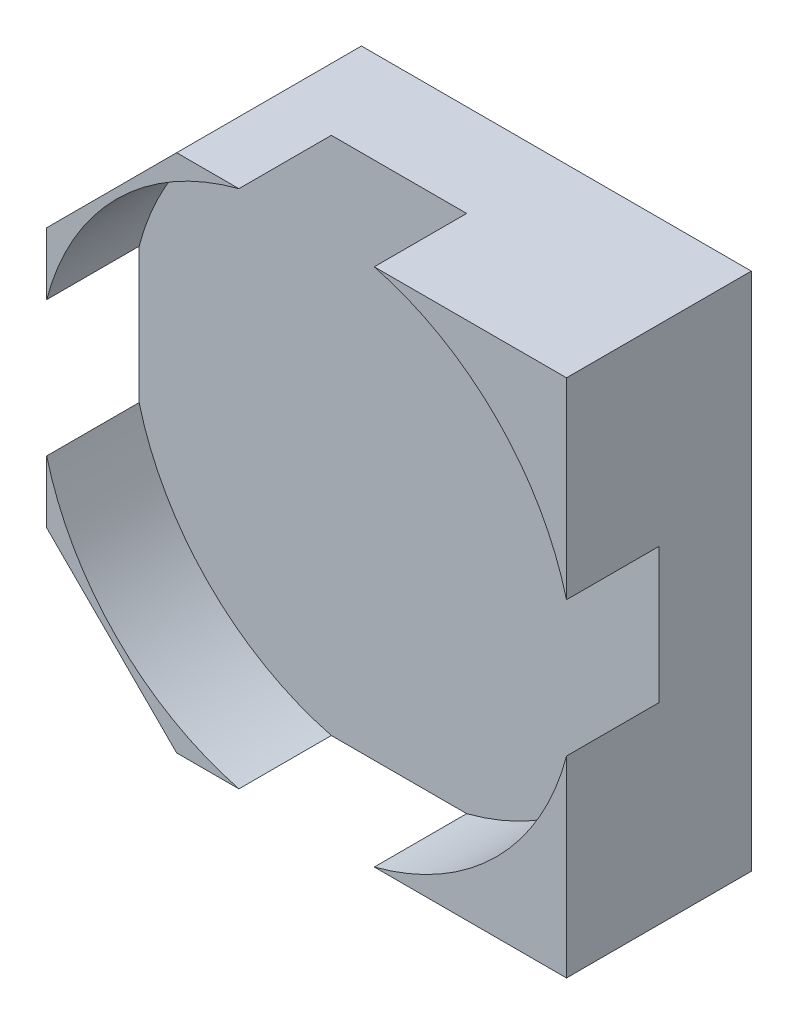
ISO-10303-21;
HEADER;
FILE_DESCRIPTION(('STEP AP214'),'2;1');
FILE_NAME('part.step','',(''),(''),'','','');
FILE_SCHEMA(('AUTOMOTIVE_DESIGN { 1 0 10303 214 1 1 1 1 }'));
ENDSEC;
DATA;
#1=APPLICATION_CONTEXT('core data for automotive mechanical design processes');
#2=APPLICATION_PROTOCOL_DEFINITION('international standard','automotive_design',2000,#1);
#3=PRODUCT_CONTEXT('',#1,'mechanical');
#4=PRODUCT('Part','Part','',(#3));
#5=PRODUCT_RELATED_PRODUCT_CATEGORY('part','',(#4));
#6=PRODUCT_DEFINITION_FORMATION('','',#4);
#7=PRODUCT_DEFINITION_CONTEXT('part definition',#1,'design');
#8=PRODUCT_DEFINITION('design','',#6,#7);
#9=PRODUCT_DEFINITION_SHAPE('','',#8);
#10=(LENGTH_UNIT() NAMED_UNIT(*) SI_UNIT(.MILLI.,.METRE.));
#11=(NAMED_UNIT(*) PLANE_ANGLE_UNIT() SI_UNIT($,.RADIAN.));
#12=(NAMED_UNIT(*) SI_UNIT($,.STERADIAN.) SOLID_ANGLE_UNIT());
#13=UNCERTAINTY_MEASURE_WITH_UNIT(LENGTH_MEASURE(1.E-05),#10,'distance_accuracy_value','');
#14=(GEOMETRIC_REPRESENTATION_CONTEXT(3) GLOBAL_UNCERTAINTY_ASSIGNED_CONTEXT((#13)) GLOBAL_UNIT_ASSIGNED_CONTEXT((#10,
#11,#12)) REPRESENTATION_CONTEXT('',''));
#15=CARTESIAN_POINT('',(0.,0.,0.));
#16=DIRECTION('',(0.,0.,1.));
#17=DIRECTION('',(1.,0.,0.));
#18=AXIS2_PLACEMENT_3D('',#15,#16,#17);
#19=CARTESIAN_POINT('',(2.25,2.25,1.9));
#20=DIRECTION('',(0.,0.,-1.));
#21=DIRECTION('',(-1.,0.,0.));
#22=AXIS2_PLACEMENT_3D('',#19,#20,#21);
#23=PLANE('',#22);
#24=DIRECTION('',(0.,1.,0.));
#25=VECTOR('',#24,1.);
#26=CARTESIAN_POINT('',(2.25,2.25,1.9));
#27=LINE('',#26,#25);
#28=CARTESIAN_POINT('',(2.25,2.25,1.9));
#29=VERTEX_POINT('',#28);
#30=CARTESIAN_POINT('',(2.25,0.585768725693,1.9));
#31=VERTEX_POINT('',#30);
#32=EDGE_CURVE('E120',#29,#31,#27,.F.);
#33=ORIENTED_EDGE('',*,*,#32,.F.);
#34=DIRECTION('',(-1.,0.,0.));
#35=VECTOR('',#34,1.);
#36=CARTESIAN_POINT('',(2.25,2.25,1.9));
#37=LINE('',#36,#35);
#38=CARTESIAN_POINT('',(0.585768725693,2.25,1.9));
#39=VERTEX_POINT('',#38);
#40=EDGE_CURVE('E115',#39,#29,#37,.F.);
#41=ORIENTED_EDGE('',*,*,#40,.F.);
#42=CARTESIAN_POINT('',(0.,0.,1.9));
#43=DIRECTION('',(0.,0.,1.));
#44=DIRECTION('',(1.,0.,0.));
#45=AXIS2_PLACEMENT_3D('',#42,#43,#44);
#46=CIRCLE('',#45,2.325);
#47=EDGE_CURVE('E20',#39,#31,#46,.F.);
#48=ORIENTED_EDGE('',*,*,#47,.T.);
#49=EDGE_LOOP('',(#33,#41,#48));
#50=FACE_BOUND('',#49,.T.);
#51=ADVANCED_FACE('F17',(#50),#23,.F.);
#52=CARTESIAN_POINT('',(2.25,2.25,1.9));
#53=DIRECTION('',(0.,0.,-1.));
#54=DIRECTION('',(-1.,0.,0.));
#55=AXIS2_PLACEMENT_3D('',#52,#53,#54);
#56=PLANE('',#55);
#57=DIRECTION('',(0.,1.,0.));
#58=VECTOR('',#57,1.);
#59=CARTESIAN_POINT('',(-2.25,2.25,1.9));
#60=LINE('',#59,#58);
#61=CARTESIAN_POINT('',(-2.25,0.585768725693,1.9));
#62=VERTEX_POINT('',#61);
#63=CARTESIAN_POINT('',(-2.25,1.125,1.9));
#64=VERTEX_POINT('',#63);
#65=EDGE_CURVE('E162',#62,#64,#60,.T.);
#66=ORIENTED_EDGE('',*,*,#65,.F.);
#67=CARTESIAN_POINT('',(0.,0.,1.9));
#68=DIRECTION('',(0.,0.,1.));
#69=DIRECTION('',(1.,0.,0.));
#70=AXIS2_PLACEMENT_3D('',#67,#68,#69);
#71=CIRCLE('',#70,2.325);
#72=CARTESIAN_POINT('',(-0.585768725693,2.25,1.9));
#73=VERTEX_POINT('',#72);
#74=EDGE_CURVE('E139',#62,#73,#71,.F.);
#75=ORIENTED_EDGE('',*,*,#74,.T.);
#76=DIRECTION('',(-1.,0.,0.));
#77=VECTOR('',#76,1.);
#78=CARTESIAN_POINT('',(2.25,2.25,1.9));
#79=LINE('',#78,#77);
#80=CARTESIAN_POINT('',(-1.125,2.25,1.9));
#81=VERTEX_POINT('',#80);
#82=EDGE_CURVE('E128',#81,#73,#79,.F.);
#83=ORIENTED_EDGE('',*,*,#82,.F.);
#84=DIRECTION('',(0.707106781186547,0.707106781186547,0.));
#85=VECTOR('',#84,1.);
#86=CARTESIAN_POINT('',(-2.25,1.125,1.9));
#87=LINE('',#86,#85);
#88=EDGE_CURVE('E159',#64,#81,#87,.T.);
#89=ORIENTED_EDGE('',*,*,#88,.F.);
#90=EDGE_LOOP('',(#66,#75,#83,#89));
#91=FACE_BOUND('',#90,.T.);
#92=ADVANCED_FACE('F267',(#91),#56,.F.);
#93=CARTESIAN_POINT('',(2.25,2.25,1.9));
#94=DIRECTION('',(0.,0.,-1.));
#95=DIRECTION('',(-1.,0.,0.));
#96=AXIS2_PLACEMENT_3D('',#93,#94,#95);
#97=PLANE('',#96);
#98=DIRECTION('',(-1.,0.,0.));
#99=VECTOR('',#98,1.);
#100=CARTESIAN_POINT('',(2.25,-2.25,1.9));
#101=LINE('',#100,#99);
#102=CARTESIAN_POINT('',(-0.585768725692999,-2.25,1.9));
#103=VERTEX_POINT('',#102);
#104=CARTESIAN_POINT('',(-1.125,-2.25,1.9));
#105=VERTEX_POINT('',#104);
#106=EDGE_CURVE('E153',#103,#105,#101,.T.);
#107=ORIENTED_EDGE('',*,*,#106,.F.);
#108=CARTESIAN_POINT('',(0.,0.,1.9));
#109=DIRECTION('',(0.,0.,1.));
#110=DIRECTION('',(1.,0.,0.));
#111=AXIS2_PLACEMENT_3D('',#108,#109,#110);
#112=CIRCLE('',#111,2.325);
#113=CARTESIAN_POINT('',(-2.25,-0.585768725692999,1.9));
#114=VERTEX_POINT('',#113);
#115=EDGE_CURVE('E222',#103,#114,#112,.F.);
#116=ORIENTED_EDGE('',*,*,#115,.T.);
#117=DIRECTION('',(0.,1.,0.));
#118=VECTOR('',#117,1.);
#119=CARTESIAN_POINT('',(-2.25,2.25,1.9));
#120=LINE('',#119,#118);
#121=CARTESIAN_POINT('',(-2.25,-1.125,1.9));
#122=VERTEX_POINT('',#121);
#123=EDGE_CURVE('E155',#122,#114,#120,.T.);
#124=ORIENTED_EDGE('',*,*,#123,.F.);
#125=DIRECTION('',(-0.707106781186547,0.707106781186547,0.));
#126=VECTOR('',#125,1.);
#127=CARTESIAN_POINT('',(-1.125,-2.25,1.9));
#128=LINE('',#127,#126);
#129=EDGE_CURVE('E150',#105,#122,#128,.T.);
#130=ORIENTED_EDGE('',*,*,#129,.F.);
#131=EDGE_LOOP('',(#107,#116,#124,#130));
#132=FACE_BOUND('',#131,.T.);
#133=ADVANCED_FACE('F398',(#132),#97,.F.);
#134=CARTESIAN_POINT('',(2.25,2.25,1.9));
#135=DIRECTION('',(0.,0.,-1.));
#136=DIRECTION('',(-1.,0.,0.));
#137=AXIS2_PLACEMENT_3D('',#134,#135,#136);
#138=PLANE('',#137);
#139=DIRECTION('',(0.,1.,0.));
#140=VECTOR('',#139,1.);
#141=CARTESIAN_POINT('',(2.25,2.25,1.9));
#142=LINE('',#141,#140);
#143=CARTESIAN_POINT('',(2.25,-0.585768725692999,1.9));
#144=VERTEX_POINT('',#143);
#145=CARTESIAN_POINT('',(2.25,-2.25,1.9));
#146=VERTEX_POINT('',#145);
#147=EDGE_CURVE('E146',#144,#146,#142,.F.);
#148=ORIENTED_EDGE('',*,*,#147,.F.);
#149=CARTESIAN_POINT('',(0.,0.,1.9));
#150=DIRECTION('',(0.,0.,1.));
#151=DIRECTION('',(1.,0.,0.));
#152=AXIS2_PLACEMENT_3D('',#149,#150,#151);
#153=CIRCLE('',#152,2.325);
#154=CARTESIAN_POINT('',(0.585768725692999,-2.25,1.9));
#155=VERTEX_POINT('',#154);
#156=EDGE_CURVE('E218',#144,#155,#153,.F.);
#157=ORIENTED_EDGE('',*,*,#156,.T.);
#158=DIRECTION('',(-1.,0.,0.));
#159=VECTOR('',#158,1.);
#160=CARTESIAN_POINT('',(2.25,-2.25,1.9));
#161=LINE('',#160,#159);
#162=EDGE_CURVE('E132',#146,#155,#161,.T.);
#163=ORIENTED_EDGE('',*,*,#162,.F.);
#164=EDGE_LOOP('',(#148,#157,#163));
#165=FACE_BOUND('',#164,.T.);
#166=ADVANCED_FACE('F278',(#165),#138,.F.);
#167=CARTESIAN_POINT('',(0.,0.,1.1));
#168=DIRECTION('',(0.,0.,1.));
#169=DIRECTION('',(1.,0.,0.));
#170=AXIS2_PLACEMENT_3D('',#167,#168,#169);
#171=CYLINDRICAL_SURFACE('',#170,2.325);
#172=CARTESIAN_POINT('',(0.,0.,1.1));
#173=DIRECTION('',(0.,0.,1.));
#174=DIRECTION('',(1.,0.,0.));
#175=AXIS2_PLACEMENT_3D('',#172,#173,#174);
#176=CIRCLE('',#175,2.325);
#177=CARTESIAN_POINT('',(2.25,0.585768725693,1.1));
#178=VERTEX_POINT('',#177);
#179=CARTESIAN_POINT('',(0.585768725693,2.25,1.1));
#180=VERTEX_POINT('',#179);
#181=EDGE_CURVE('E135',#178,#180,#176,.T.);
#182=ORIENTED_EDGE('',*,*,#181,.F.);
#183=DIRECTION('',(0.,0.,1.));
#184=VECTOR('',#183,1.);
#185=CARTESIAN_POINT('',(2.25,0.585768725693,1.1));
#186=LINE('',#185,#184);
#187=EDGE_CURVE('E124',#31,#178,#186,.F.);
#188=ORIENTED_EDGE('',*,*,#187,.F.);
#189=ORIENTED_EDGE('',*,*,#47,.F.);
#190=DIRECTION('',(0.,0.,1.));
#191=VECTOR('',#190,1.);
#192=CARTESIAN_POINT('',(0.585768725693,2.25,1.1));
#193=LINE('',#192,#191);
#194=EDGE_CURVE('E137',#180,#39,#193,.T.);
#195=ORIENTED_EDGE('',*,*,#194,.F.);
#196=EDGE_LOOP('',(#182,#188,#189,#195));
#197=FACE_BOUND('',#196,.T.);
#198=ADVANCED_FACE('F133',(#197),#171,.F.);
#199=CARTESIAN_POINT('',(0.,0.,1.1));
#200=DIRECTION('',(0.,0.,1.));
#201=DIRECTION('',(1.,0.,0.));
#202=AXIS2_PLACEMENT_3D('',#199,#200,#201);
#203=CYLINDRICAL_SURFACE('',#202,2.325);
#204=CARTESIAN_POINT('',(0.,0.,1.1));
#205=DIRECTION('',(0.,0.,1.));
#206=DIRECTION('',(1.,0.,0.));
#207=AXIS2_PLACEMENT_3D('',#204,#205,#206);
#208=CIRCLE('',#207,2.325);
#209=CARTESIAN_POINT('',(-0.585768725693,2.25,1.1));
#210=VERTEX_POINT('',#209);
#211=CARTESIAN_POINT('',(-2.25,0.585768725693,1.1));
#212=VERTEX_POINT('',#211);
#213=EDGE_CURVE('E213',#210,#212,#208,.T.);
#214=ORIENTED_EDGE('',*,*,#213,.F.);
#215=DIRECTION('',(0.,0.,1.));
#216=VECTOR('',#215,1.);
#217=CARTESIAN_POINT('',(-0.585768725693,2.25,1.1));
#218=LINE('',#217,#216);
#219=EDGE_CURVE('E227',#73,#210,#218,.F.);
#220=ORIENTED_EDGE('',*,*,#219,.F.);
#221=ORIENTED_EDGE('',*,*,#74,.F.);
#222=DIRECTION('',(0.,0.,1.));
#223=VECTOR('',#222,1.);
#224=CARTESIAN_POINT('',(-2.25,0.585768725693,1.1));
#225=LINE('',#224,#223);
#226=EDGE_CURVE('E142',#212,#62,#225,.T.);
#227=ORIENTED_EDGE('',*,*,#226,.F.);
#228=EDGE_LOOP('',(#214,#220,#221,#227));
#229=FACE_BOUND('',#228,.T.);
#230=ADVANCED_FACE('F371',(#229),#203,.F.);
#231=CARTESIAN_POINT('',(0.,0.,1.1));
#232=DIRECTION('',(0.,0.,1.));
#233=DIRECTION('',(1.,0.,0.));
#234=AXIS2_PLACEMENT_3D('',#231,#232,#233);
#235=CYLINDRICAL_SURFACE('',#234,2.325);
#236=DIRECTION('',(0.,0.,1.));
#237=VECTOR('',#236,1.);
#238=CARTESIAN_POINT('',(-2.25,-0.585768725693,1.1));
#239=LINE('',#238,#237);
#240=CARTESIAN_POINT('',(-2.25,-0.585768725692999,1.1));
#241=VERTEX_POINT('',#240);
#242=EDGE_CURVE('E224',#114,#241,#239,.F.);
#243=ORIENTED_EDGE('',*,*,#242,.F.);
#244=ORIENTED_EDGE('',*,*,#115,.F.);
#245=DIRECTION('',(0.,0.,1.));
#246=VECTOR('',#245,1.);
#247=CARTESIAN_POINT('',(-0.585768725692999,-2.25,1.1));
#248=LINE('',#247,#246);
#249=CARTESIAN_POINT('',(-0.585768725692999,-2.25,1.1));
#250=VERTEX_POINT('',#249);
#251=EDGE_CURVE('E225',#250,#103,#248,.T.);
#252=ORIENTED_EDGE('',*,*,#251,.F.);
#253=CARTESIAN_POINT('',(0.,0.,1.1));
#254=DIRECTION('',(0.,0.,1.));
#255=DIRECTION('',(1.,0.,0.));
#256=AXIS2_PLACEMENT_3D('',#253,#254,#255);
#257=CIRCLE('',#256,2.325);
#258=EDGE_CURVE('E210',#241,#250,#257,.T.);
#259=ORIENTED_EDGE('',*,*,#258,.F.);
#260=EDGE_LOOP('',(#243,#244,#252,#259));
#261=FACE_BOUND('',#260,.T.);
#262=ADVANCED_FACE('F362',(#261),#235,.F.);
#263=CARTESIAN_POINT('',(0.,0.,1.1));
#264=DIRECTION('',(0.,0.,1.));
#265=DIRECTION('',(1.,0.,0.));
#266=AXIS2_PLACEMENT_3D('',#263,#264,#265);
#267=CYLINDRICAL_SURFACE('',#266,2.325);
#268=DIRECTION('',(0.,0.,1.));
#269=VECTOR('',#268,1.);
#270=CARTESIAN_POINT('',(0.585768725692999,-2.25,1.1));
#271=LINE('',#270,#269);
#272=CARTESIAN_POINT('',(0.585768725692999,-2.25,1.1));
#273=VERTEX_POINT('',#272);
#274=EDGE_CURVE('E217',#155,#273,#271,.F.);
#275=ORIENTED_EDGE('',*,*,#274,.F.);
#276=ORIENTED_EDGE('',*,*,#156,.F.);
#277=DIRECTION('',(0.,0.,1.));
#278=VECTOR('',#277,1.);
#279=CARTESIAN_POINT('',(2.25,-0.585768725692999,1.1));
#280=LINE('',#279,#278);
#281=CARTESIAN_POINT('',(2.25,-0.585768725692999,1.1));
#282=VERTEX_POINT('',#281);
#283=EDGE_CURVE('E221',#282,#144,#280,.T.);
#284=ORIENTED_EDGE('',*,*,#283,.F.);
#285=CARTESIAN_POINT('',(0.,0.,1.1));
#286=DIRECTION('',(0.,0.,1.));
#287=DIRECTION('',(1.,0.,0.));
#288=AXIS2_PLACEMENT_3D('',#285,#286,#287);
#289=CIRCLE('',#288,2.325);
#290=EDGE_CURVE('E206',#273,#282,#289,.T.);
#291=ORIENTED_EDGE('',*,*,#290,.F.);
#292=EDGE_LOOP('',(#275,#276,#284,#291));
#293=FACE_BOUND('',#292,.T.);
#294=ADVANCED_FACE('F280',(#293),#267,.F.);
#295=CARTESIAN_POINT('',(0.,0.,1.1));
#296=DIRECTION('',(0.,0.,1.));
#297=DIRECTION('',(1.,0.,0.));
#298=AXIS2_PLACEMENT_3D('',#295,#296,#297);
#299=PLANE('',#298);
#300=DIRECTION('',(1.,0.,0.));
#301=VECTOR('',#300,1.);
#302=CARTESIAN_POINT('',(-1.125,-2.25,1.1));
#303=LINE('',#302,#301);
#304=EDGE_CURVE('E177',#250,#273,#303,.T.);
#305=ORIENTED_EDGE('',*,*,#304,.T.);
#306=ORIENTED_EDGE('',*,*,#290,.T.);
#307=DIRECTION('',(0.,1.,0.));
#308=VECTOR('',#307,1.);
#309=CARTESIAN_POINT('',(2.25,-2.25,1.1));
#310=LINE('',#309,#308);
#311=EDGE_CURVE('E209',#282,#178,#310,.T.);
#312=ORIENTED_EDGE('',*,*,#311,.T.);
#313=ORIENTED_EDGE('',*,*,#181,.T.);
#314=DIRECTION('',(1.,0.,0.));
#315=VECTOR('',#314,1.);
#316=CARTESIAN_POINT('',(2.25,2.25,1.1));
#317=LINE('',#316,#315);
#318=EDGE_CURVE('E200',#180,#210,#317,.F.);
#319=ORIENTED_EDGE('',*,*,#318,.T.);
#320=ORIENTED_EDGE('',*,*,#213,.T.);
#321=DIRECTION('',(0.,1.,0.));
#322=VECTOR('',#321,1.);
#323=CARTESIAN_POINT('',(-2.25,1.125,1.1));
#324=LINE('',#323,#322);
#325=EDGE_CURVE('E181',#212,#241,#324,.F.);
#326=ORIENTED_EDGE('',*,*,#325,.T.);
#327=ORIENTED_EDGE('',*,*,#258,.T.);
#328=EDGE_LOOP('',(#305,#306,#312,#313,#319,#320,#326,#327));
#329=FACE_BOUND('',#328,.T.);
#330=ADVANCED_FACE('F270',(#329),#299,.T.);
#331=CARTESIAN_POINT('',(2.25,-2.25,0.3));
#332=DIRECTION('',(-1.,0.,0.));
#333=DIRECTION('',(0.,0.,1.));
#334=AXIS2_PLACEMENT_3D('',#331,#332,#333);
#335=PLANE('',#334);
#336=ORIENTED_EDGE('',*,*,#32,.T.);
#337=ORIENTED_EDGE('',*,*,#187,.T.);
#338=ORIENTED_EDGE('',*,*,#311,.F.);
#339=ORIENTED_EDGE('',*,*,#283,.T.);
#340=ORIENTED_EDGE('',*,*,#147,.T.);
#341=DIRECTION('',(0.,0.,1.));
#342=VECTOR('',#341,1.);
#343=CARTESIAN_POINT('',(2.25,-2.25,0.3));
#344=LINE('',#343,#342);
#345=CARTESIAN_POINT('',(2.25,-2.25,0.3));
#346=VERTEX_POINT('',#345);
#347=EDGE_CURVE('E174',#146,#346,#344,.F.);
#348=ORIENTED_EDGE('',*,*,#347,.T.);
#349=DIRECTION('',(0.,1.,0.));
#350=VECTOR('',#349,1.);
#351=CARTESIAN_POINT('',(2.25,2.25,0.3));
#352=LINE('',#351,#350);
#353=CARTESIAN_POINT('',(2.25,2.25,0.3));
#354=VERTEX_POINT('',#353);
#355=EDGE_CURVE('E199',#354,#346,#352,.F.);
#356=ORIENTED_EDGE('',*,*,#355,.F.);
#357=DIRECTION('',(0.,0.,-1.));
#358=VECTOR('',#357,1.);
#359=CARTESIAN_POINT('',(2.25,2.25,0.3));
#360=LINE('',#359,#358);
#361=EDGE_CURVE('E127',#354,#29,#360,.F.);
#362=ORIENTED_EDGE('',*,*,#361,.T.);
#363=EDGE_LOOP('',(#336,#337,#338,#339,#340,#348,#356,#362));
#364=FACE_BOUND('',#363,.T.);
#365=ADVANCED_FACE('F121',(#364),#335,.F.);
#366=CARTESIAN_POINT('',(-1.125,-2.25,0.3));
#367=DIRECTION('',(0.,1.,0.));
#368=DIRECTION('',(0.,0.,1.));
#369=AXIS2_PLACEMENT_3D('',#366,#367,#368);
#370=PLANE('',#369);
#371=ORIENTED_EDGE('',*,*,#162,.T.);
#372=ORIENTED_EDGE('',*,*,#274,.T.);
#373=ORIENTED_EDGE('',*,*,#304,.F.);
#374=ORIENTED_EDGE('',*,*,#251,.T.);
#375=ORIENTED_EDGE('',*,*,#106,.T.);
#376=DIRECTION('',(0.,0.,1.));
#377=VECTOR('',#376,1.);
#378=CARTESIAN_POINT('',(-1.125,-2.25,0.3));
#379=LINE('',#378,#377);
#380=CARTESIAN_POINT('',(-1.125,-2.25,0.3));
#381=VERTEX_POINT('',#380);
#382=EDGE_CURVE('E176',#105,#381,#379,.F.);
#383=ORIENTED_EDGE('',*,*,#382,.T.);
#384=DIRECTION('',(-1.,0.,0.));
#385=VECTOR('',#384,1.);
#386=CARTESIAN_POINT('',(2.25,-2.25,0.3));
#387=LINE('',#386,#385);
#388=EDGE_CURVE('E250',#346,#381,#387,.T.);
#389=ORIENTED_EDGE('',*,*,#388,.F.);
#390=ORIENTED_EDGE('',*,*,#347,.F.);
#391=EDGE_LOOP('',(#371,#372,#373,#374,#375,#383,#389,#390));
#392=FACE_BOUND('',#391,.T.);
#393=ADVANCED_FACE('F283',(#392),#370,.F.);
#394=CARTESIAN_POINT('',(-2.25,-1.125,0.3));
#395=DIRECTION('',(0.707106781186548,0.707106781186548,0.));
#396=DIRECTION('',(-0.707106781186548,0.707106781186548,0.));
#397=AXIS2_PLACEMENT_3D('',#394,#395,#396);
#398=PLANE('',#397);
#399=ORIENTED_EDGE('',*,*,#382,.F.);
#400=ORIENTED_EDGE('',*,*,#129,.T.);
#401=DIRECTION('',(0.,0.,-1.));
#402=VECTOR('',#401,1.);
#403=CARTESIAN_POINT('',(-2.25,-1.125,0.3));
#404=LINE('',#403,#402);
#405=CARTESIAN_POINT('',(-2.25,-1.125,0.3));
#406=VERTEX_POINT('',#405);
#407=EDGE_CURVE('E187',#122,#406,#404,.T.);
#408=ORIENTED_EDGE('',*,*,#407,.T.);
#409=DIRECTION('',(-0.707106781186547,0.707106781186547,0.));
#410=VECTOR('',#409,1.);
#411=CARTESIAN_POINT('',(-1.125,-2.25,0.3));
#412=LINE('',#411,#410);
#413=EDGE_CURVE('E253',#381,#406,#412,.T.);
#414=ORIENTED_EDGE('',*,*,#413,.F.);
#415=EDGE_LOOP('',(#399,#400,#408,#414));
#416=FACE_BOUND('',#415,.T.);
#417=ADVANCED_FACE('F288',(#416),#398,.F.);
#418=CARTESIAN_POINT('',(-2.25,1.125,0.3));
#419=DIRECTION('',(1.,0.,0.));
#420=DIRECTION('',(0.,0.,-1.));
#421=AXIS2_PLACEMENT_3D('',#418,#419,#420);
#422=PLANE('',#421);
#423=ORIENTED_EDGE('',*,*,#123,.T.);
#424=ORIENTED_EDGE('',*,*,#242,.T.);
#425=ORIENTED_EDGE('',*,*,#325,.F.);
#426=ORIENTED_EDGE('',*,*,#226,.T.);
#427=ORIENTED_EDGE('',*,*,#65,.T.);
#428=DIRECTION('',(0.,0.,1.));
#429=VECTOR('',#428,1.);
#430=CARTESIAN_POINT('',(-2.25,1.125,0.3));
#431=LINE('',#430,#429);
#432=CARTESIAN_POINT('',(-2.25,1.125,0.3));
#433=VERTEX_POINT('',#432);
#434=EDGE_CURVE('E189',#64,#433,#431,.F.);
#435=ORIENTED_EDGE('',*,*,#434,.T.);
#436=DIRECTION('',(0.,1.,0.));
#437=VECTOR('',#436,1.);
#438=CARTESIAN_POINT('',(-2.25,2.25,0.3));
#439=LINE('',#438,#437);
#440=EDGE_CURVE('E256',#406,#433,#439,.T.);
#441=ORIENTED_EDGE('',*,*,#440,.F.);
#442=ORIENTED_EDGE('',*,*,#407,.F.);
#443=EDGE_LOOP('',(#423,#424,#425,#426,#427,#435,#441,#442));
#444=FACE_BOUND('',#443,.T.);
#445=ADVANCED_FACE('F292',(#444),#422,.F.);
#446=CARTESIAN_POINT('',(-1.125,2.25,0.3));
#447=DIRECTION('',(0.707106781186548,-0.707106781186548,0.));
#448=DIRECTION('',(0.707106781186548,0.707106781186548,0.));
#449=AXIS2_PLACEMENT_3D('',#446,#447,#448);
#450=PLANE('',#449);
#451=ORIENTED_EDGE('',*,*,#434,.F.);
#452=ORIENTED_EDGE('',*,*,#88,.T.);
#453=DIRECTION('',(0.,0.,-1.));
#454=VECTOR('',#453,1.);
#455=CARTESIAN_POINT('',(-1.125,2.25,0.3));
#456=LINE('',#455,#454);
#457=CARTESIAN_POINT('',(-1.125,2.25,0.3));
#458=VERTEX_POINT('',#457);
#459=EDGE_CURVE('E35',#81,#458,#456,.T.);
#460=ORIENTED_EDGE('',*,*,#459,.T.);
#461=DIRECTION('',(0.707106781186547,0.707106781186547,0.));
#462=VECTOR('',#461,1.);
#463=CARTESIAN_POINT('',(-2.25,1.125,0.3));
#464=LINE('',#463,#462);
#465=EDGE_CURVE('E26',#433,#458,#464,.T.);
#466=ORIENTED_EDGE('',*,*,#465,.F.);
#467=EDGE_LOOP('',(#451,#452,#460,#466));
#468=FACE_BOUND('',#467,.T.);
#469=ADVANCED_FACE('F264',(#468),#450,.F.);
#470=CARTESIAN_POINT('',(2.25,2.25,0.3));
#471=DIRECTION('',(0.,-1.,0.));
#472=DIRECTION('',(0.,0.,-1.));
#473=AXIS2_PLACEMENT_3D('',#470,#471,#472);
#474=PLANE('',#473);
#475=ORIENTED_EDGE('',*,*,#82,.T.);
#476=ORIENTED_EDGE('',*,*,#219,.T.);
#477=ORIENTED_EDGE('',*,*,#318,.F.);
#478=ORIENTED_EDGE('',*,*,#194,.T.);
#479=ORIENTED_EDGE('',*,*,#40,.T.);
#480=ORIENTED_EDGE('',*,*,#361,.F.);
#481=DIRECTION('',(-1.,0.,0.));
#482=VECTOR('',#481,1.);
#483=CARTESIAN_POINT('',(2.25,2.25,0.3));
#484=LINE('',#483,#482);
#485=EDGE_CURVE('E11',#458,#354,#484,.F.);
#486=ORIENTED_EDGE('',*,*,#485,.F.);
#487=ORIENTED_EDGE('',*,*,#459,.F.);
#488=EDGE_LOOP('',(#475,#476,#477,#478,#479,#480,#486,#487));
#489=FACE_BOUND('',#488,.T.);
#490=ADVANCED_FACE('F268',(#489),#474,.F.);
#491=CARTESIAN_POINT('',(2.25,2.25,0.3));
#492=DIRECTION('',(0.,0.,-1.));
#493=DIRECTION('',(-1.,0.,0.));
#494=AXIS2_PLACEMENT_3D('',#491,#492,#493);
#495=PLANE('',#494);
#496=ORIENTED_EDGE('',*,*,#465,.T.);
#497=ORIENTED_EDGE('',*,*,#485,.T.);
#498=ORIENTED_EDGE('',*,*,#355,.T.);
#499=ORIENTED_EDGE('',*,*,#388,.T.);
#500=ORIENTED_EDGE('',*,*,#413,.T.);
#501=ORIENTED_EDGE('',*,*,#440,.T.);
#502=EDGE_LOOP('',(#496,#497,#498,#499,#500,#501));
#503=FACE_BOUND('',#502,.T.);
#504=ADVANCED_FACE('F261',(#503),#495,.T.);
#505=CLOSED_SHELL('',(#51,#92,#133,#166,#198,#230,#262,#294,#330,#365,#393,#417,#445,#469,#490,#504));
#506=MANIFOLD_SOLID_BREP('B1',#505);
#507=ADVANCED_BREP_SHAPE_REPRESENTATION('',(#18,#506),#14);
#508=SHAPE_DEFINITION_REPRESENTATION(#9,#507);
ENDSEC;
END-ISO-10303-21;
